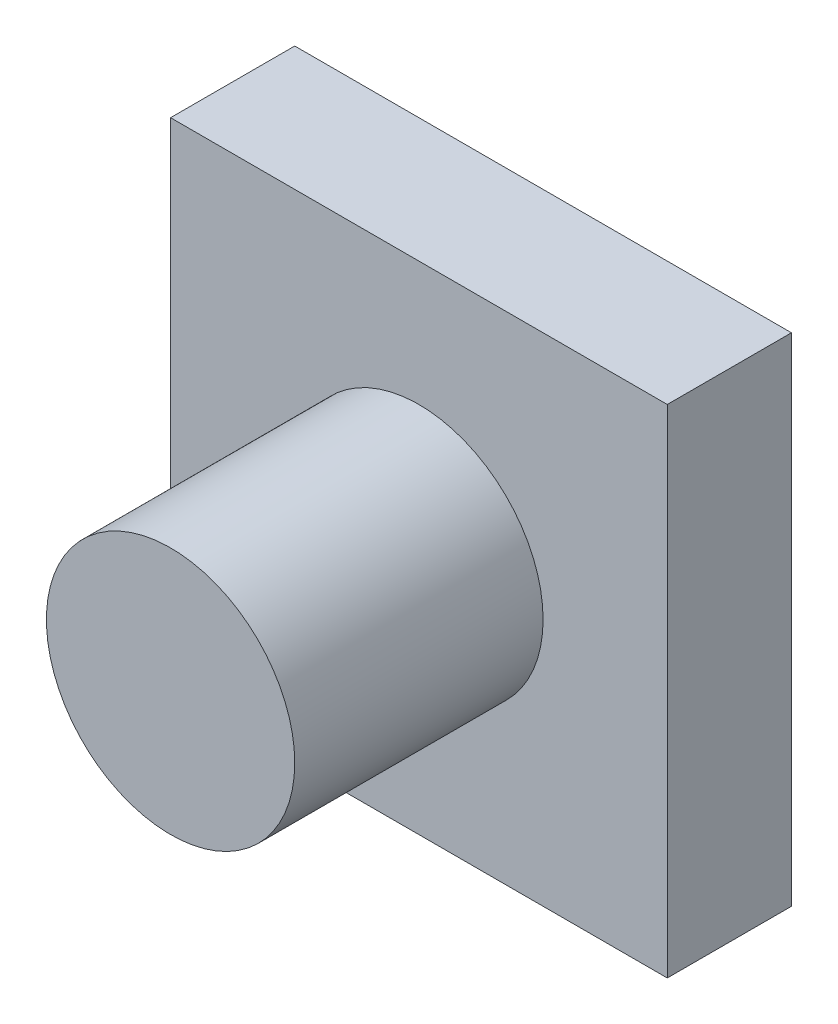
ISO-10303-21;
HEADER;
FILE_DESCRIPTION(('STEP AP214'),'2;1');
FILE_NAME('part.step','',(''),(''),'','','');
FILE_SCHEMA(('AUTOMOTIVE_DESIGN { 1 0 10303 214 1 1 1 1 }'));
ENDSEC;
DATA;
#1=APPLICATION_CONTEXT('core data for automotive mechanical design processes');
#2=APPLICATION_PROTOCOL_DEFINITION('international standard','automotive_design',2000,#1);
#3=PRODUCT_CONTEXT('',#1,'mechanical');
#4=PRODUCT('Part','Part','',(#3));
#5=PRODUCT_RELATED_PRODUCT_CATEGORY('part','',(#4));
#6=PRODUCT_DEFINITION_FORMATION('','',#4);
#7=PRODUCT_DEFINITION_CONTEXT('part definition',#1,'design');
#8=PRODUCT_DEFINITION('design','',#6,#7);
#9=PRODUCT_DEFINITION_SHAPE('','',#8);
#10=(LENGTH_UNIT() NAMED_UNIT(*) SI_UNIT(.MILLI.,.METRE.));
#11=(NAMED_UNIT(*) PLANE_ANGLE_UNIT() SI_UNIT($,.RADIAN.));
#12=(NAMED_UNIT(*) SI_UNIT($,.STERADIAN.) SOLID_ANGLE_UNIT());
#13=UNCERTAINTY_MEASURE_WITH_UNIT(LENGTH_MEASURE(1.E-05),#10,'distance_accuracy_value','');
#14=(GEOMETRIC_REPRESENTATION_CONTEXT(3) GLOBAL_UNCERTAINTY_ASSIGNED_CONTEXT((#13)) GLOBAL_UNIT_ASSIGNED_CONTEXT((#10,
#11,#12)) REPRESENTATION_CONTEXT('',''));
#15=CARTESIAN_POINT('',(0.,0.,0.));
#16=DIRECTION('',(0.,0.,1.));
#17=DIRECTION('',(1.,0.,0.));
#18=AXIS2_PLACEMENT_3D('',#15,#16,#17);
#19=CARTESIAN_POINT('',(-13.2890365448505,15.2159468438538,10.));
#20=DIRECTION('',(1.,0.,0.));
#21=DIRECTION('',(0.,1.,0.));
#22=AXIS2_PLACEMENT_3D('',#19,#20,#21);
#23=PLANE('',#22);
#24=DIRECTION('',(0.,-1.,0.));
#25=VECTOR('',#24,1.);
#26=CARTESIAN_POINT('',(-13.2890365448505,15.2159468438538,0.));
#27=LINE('',#26,#25);
#28=CARTESIAN_POINT('',(-13.2890365448505,15.2159468438538,0.));
#29=VERTEX_POINT('',#28);
#30=CARTESIAN_POINT('',(-13.2890365448505,-24.7840531561462,0.));
#31=VERTEX_POINT('',#30);
#32=EDGE_CURVE('E98',#29,#31,#27,.T.);
#33=ORIENTED_EDGE('',*,*,#32,.T.);
#34=DIRECTION('',(0.,0.,-1.));
#35=VECTOR('',#34,1.);
#36=CARTESIAN_POINT('',(-13.2890365448505,-24.7840531561462,10.));
#37=LINE('',#36,#35);
#38=CARTESIAN_POINT('',(-13.2890365448505,-24.7840531561462,10.));
#39=VERTEX_POINT('',#38);
#40=EDGE_CURVE('E35',#39,#31,#37,.T.);
#41=ORIENTED_EDGE('',*,*,#40,.F.);
#42=DIRECTION('',(0.,-1.,0.));
#43=VECTOR('',#42,1.);
#44=CARTESIAN_POINT('',(-13.2890365448505,15.2159468438538,10.));
#45=LINE('',#44,#43);
#46=CARTESIAN_POINT('',(-13.2890365448505,15.2159468438538,10.));
#47=VERTEX_POINT('',#46);
#48=EDGE_CURVE('E85',#47,#39,#45,.T.);
#49=ORIENTED_EDGE('',*,*,#48,.F.);
#50=DIRECTION('',(0.,0.,-1.));
#51=VECTOR('',#50,1.);
#52=CARTESIAN_POINT('',(-13.2890365448505,15.2159468438538,10.));
#53=LINE('',#52,#51);
#54=EDGE_CURVE('E94',#47,#29,#53,.T.);
#55=ORIENTED_EDGE('',*,*,#54,.T.);
#56=EDGE_LOOP('',(#33,#41,#49,#55));
#57=FACE_BOUND('',#56,.T.);
#58=ADVANCED_FACE('F32',(#57),#23,.F.);
#59=CARTESIAN_POINT('',(-13.2890365448505,-24.7840531561462,10.));
#60=DIRECTION('',(0.,1.,0.));
#61=DIRECTION('',(0.,0.,1.));
#62=AXIS2_PLACEMENT_3D('',#59,#60,#61);
#63=PLANE('',#62);
#64=DIRECTION('',(1.,0.,0.));
#65=VECTOR('',#64,1.);
#66=CARTESIAN_POINT('',(-13.2890365448505,-24.7840531561462,0.));
#67=LINE('',#66,#65);
#68=CARTESIAN_POINT('',(26.7109634551495,-24.7840531561462,0.));
#69=VERTEX_POINT('',#68);
#70=EDGE_CURVE('E90',#31,#69,#67,.T.);
#71=ORIENTED_EDGE('',*,*,#70,.T.);
#72=DIRECTION('',(0.,0.,-1.));
#73=VECTOR('',#72,1.);
#74=CARTESIAN_POINT('',(26.7109634551495,-24.7840531561462,10.));
#75=LINE('',#74,#73);
#76=CARTESIAN_POINT('',(26.7109634551495,-24.7840531561462,10.));
#77=VERTEX_POINT('',#76);
#78=EDGE_CURVE('E88',#77,#69,#75,.T.);
#79=ORIENTED_EDGE('',*,*,#78,.F.);
#80=DIRECTION('',(1.,0.,0.));
#81=VECTOR('',#80,1.);
#82=CARTESIAN_POINT('',(-13.2890365448505,-24.7840531561462,10.));
#83=LINE('',#82,#81);
#84=EDGE_CURVE('E80',#39,#77,#83,.T.);
#85=ORIENTED_EDGE('',*,*,#84,.F.);
#86=ORIENTED_EDGE('',*,*,#40,.T.);
#87=EDGE_LOOP('',(#71,#79,#85,#86));
#88=FACE_BOUND('',#87,.T.);
#89=ADVANCED_FACE('F89',(#88),#63,.F.);
#90=CARTESIAN_POINT('',(26.7109634551495,15.2159468438538,10.));
#91=DIRECTION('',(-1.,0.,0.));
#92=DIRECTION('',(0.,0.,1.));
#93=AXIS2_PLACEMENT_3D('',#90,#91,#92);
#94=PLANE('',#93);
#95=DIRECTION('',(0.,1.,0.));
#96=VECTOR('',#95,1.);
#97=CARTESIAN_POINT('',(26.7109634551495,15.2159468438538,0.));
#98=LINE('',#97,#96);
#99=CARTESIAN_POINT('',(26.7109634551495,15.2159468438538,0.));
#100=VERTEX_POINT('',#99);
#101=EDGE_CURVE('E66',#69,#100,#98,.T.);
#102=ORIENTED_EDGE('',*,*,#101,.T.);
#103=DIRECTION('',(0.,0.,-1.));
#104=VECTOR('',#103,1.);
#105=CARTESIAN_POINT('',(26.7109634551495,15.2159468438538,10.));
#106=LINE('',#105,#104);
#107=CARTESIAN_POINT('',(26.7109634551495,15.2159468438538,10.));
#108=VERTEX_POINT('',#107);
#109=EDGE_CURVE('E91',#108,#100,#106,.T.);
#110=ORIENTED_EDGE('',*,*,#109,.F.);
#111=DIRECTION('',(0.,1.,0.));
#112=VECTOR('',#111,1.);
#113=CARTESIAN_POINT('',(26.7109634551495,15.2159468438538,10.));
#114=LINE('',#113,#112);
#115=EDGE_CURVE('E83',#77,#108,#114,.T.);
#116=ORIENTED_EDGE('',*,*,#115,.F.);
#117=ORIENTED_EDGE('',*,*,#78,.T.);
#118=EDGE_LOOP('',(#102,#110,#116,#117));
#119=FACE_BOUND('',#118,.T.);
#120=ADVANCED_FACE('F92',(#119),#94,.F.);
#121=CARTESIAN_POINT('',(-13.2890365448505,15.2159468438538,10.));
#122=DIRECTION('',(0.,-1.,0.));
#123=DIRECTION('',(0.,0.,-1.));
#124=AXIS2_PLACEMENT_3D('',#121,#122,#123);
#125=PLANE('',#124);
#126=DIRECTION('',(-1.,0.,0.));
#127=VECTOR('',#126,1.);
#128=CARTESIAN_POINT('',(-13.2890365448505,15.2159468438538,0.));
#129=LINE('',#128,#127);
#130=EDGE_CURVE('E72',#100,#29,#129,.T.);
#131=ORIENTED_EDGE('',*,*,#130,.T.);
#132=ORIENTED_EDGE('',*,*,#54,.F.);
#133=DIRECTION('',(-1.,0.,0.));
#134=VECTOR('',#133,1.);
#135=CARTESIAN_POINT('',(-13.2890365448505,15.2159468438538,10.));
#136=LINE('',#135,#134);
#137=EDGE_CURVE('E49',#108,#47,#136,.T.);
#138=ORIENTED_EDGE('',*,*,#137,.F.);
#139=ORIENTED_EDGE('',*,*,#109,.T.);
#140=EDGE_LOOP('',(#131,#132,#138,#139));
#141=FACE_BOUND('',#140,.T.);
#142=ADVANCED_FACE('F106',(#141),#125,.F.);
#143=CARTESIAN_POINT('',(0.,0.,10.));
#144=DIRECTION('',(0.,0.,1.));
#145=DIRECTION('',(1.,0.,0.));
#146=AXIS2_PLACEMENT_3D('',#143,#144,#145);
#147=PLANE('',#146);
#148=CARTESIAN_POINT('',(6.71096345514951,-4.78405315614618,10.));
#149=DIRECTION('',(0.,0.,1.));
#150=DIRECTION('',(1.,0.,0.));
#151=AXIS2_PLACEMENT_3D('',#148,#149,#150);
#152=CIRCLE('',#151,10.);
#153=CARTESIAN_POINT('',(16.7109634551495,-4.78405315614618,10.));
#154=VERTEX_POINT('',#153);
#155=EDGE_CURVE('E11',#154,#154,#152,.T.);
#156=ORIENTED_EDGE('',*,*,#155,.F.);
#157=EDGE_LOOP('',(#156));
#158=FACE_BOUND('',#157,.T.);
#159=ORIENTED_EDGE('',*,*,#48,.T.);
#160=ORIENTED_EDGE('',*,*,#84,.T.);
#161=ORIENTED_EDGE('',*,*,#115,.T.);
#162=ORIENTED_EDGE('',*,*,#137,.T.);
#163=EDGE_LOOP('',(#159,#160,#161,#162));
#164=FACE_BOUND('',#163,.T.);
#165=ADVANCED_FACE('F81',(#158,#164),#147,.T.);
#166=CARTESIAN_POINT('',(0.,0.,0.));
#167=DIRECTION('',(0.,0.,1.));
#168=DIRECTION('',(1.,0.,0.));
#169=AXIS2_PLACEMENT_3D('',#166,#167,#168);
#170=PLANE('',#169);
#171=ORIENTED_EDGE('',*,*,#32,.F.);
#172=ORIENTED_EDGE('',*,*,#130,.F.);
#173=ORIENTED_EDGE('',*,*,#101,.F.);
#174=ORIENTED_EDGE('',*,*,#70,.F.);
#175=EDGE_LOOP('',(#171,#172,#173,#174));
#176=FACE_BOUND('',#175,.T.);
#177=ADVANCED_FACE('F109',(#176),#170,.F.);
#178=CARTESIAN_POINT('',(6.71096345514951,-4.78405315614618,30.));
#179=DIRECTION('',(0.,0.,-1.));
#180=DIRECTION('',(-1.,0.,0.));
#181=AXIS2_PLACEMENT_3D('',#178,#179,#180);
#182=CYLINDRICAL_SURFACE('',#181,10.);
#183=CARTESIAN_POINT('',(6.71096345514951,-4.78405315614618,30.));
#184=DIRECTION('',(0.,0.,1.));
#185=DIRECTION('',(1.,0.,0.));
#186=AXIS2_PLACEMENT_3D('',#183,#184,#185);
#187=CIRCLE('',#186,10.);
#188=CARTESIAN_POINT('',(16.7109634551495,-4.78405315614618,30.));
#189=VERTEX_POINT('',#188);
#190=EDGE_CURVE('E101',#189,#189,#187,.T.);
#191=ORIENTED_EDGE('',*,*,#190,.F.);
#192=EDGE_LOOP('',(#191));
#193=FACE_BOUND('',#192,.T.);
#194=ORIENTED_EDGE('',*,*,#155,.T.);
#195=EDGE_LOOP('',(#194));
#196=FACE_BOUND('',#195,.T.);
#197=ADVANCED_FACE('F117',(#193,#196),#182,.T.);
#198=CARTESIAN_POINT('',(6.71096345514951,-4.78405315614618,30.));
#199=DIRECTION('',(0.,0.,1.));
#200=DIRECTION('',(1.,0.,0.));
#201=AXIS2_PLACEMENT_3D('',#198,#199,#200);
#202=PLANE('',#201);
#203=ORIENTED_EDGE('',*,*,#190,.T.);
#204=EDGE_LOOP('',(#203));
#205=FACE_BOUND('',#204,.T.);
#206=ADVANCED_FACE('F115',(#205),#202,.T.);
#207=CLOSED_SHELL('',(#58,#89,#120,#142,#165,#177,#197,#206));
#208=MANIFOLD_SOLID_BREP('B2',#207);
#209=ADVANCED_BREP_SHAPE_REPRESENTATION('',(#18,#208),#14);
#210=SHAPE_DEFINITION_REPRESENTATION(#9,#209);
ENDSEC;
END-ISO-10303-21;
